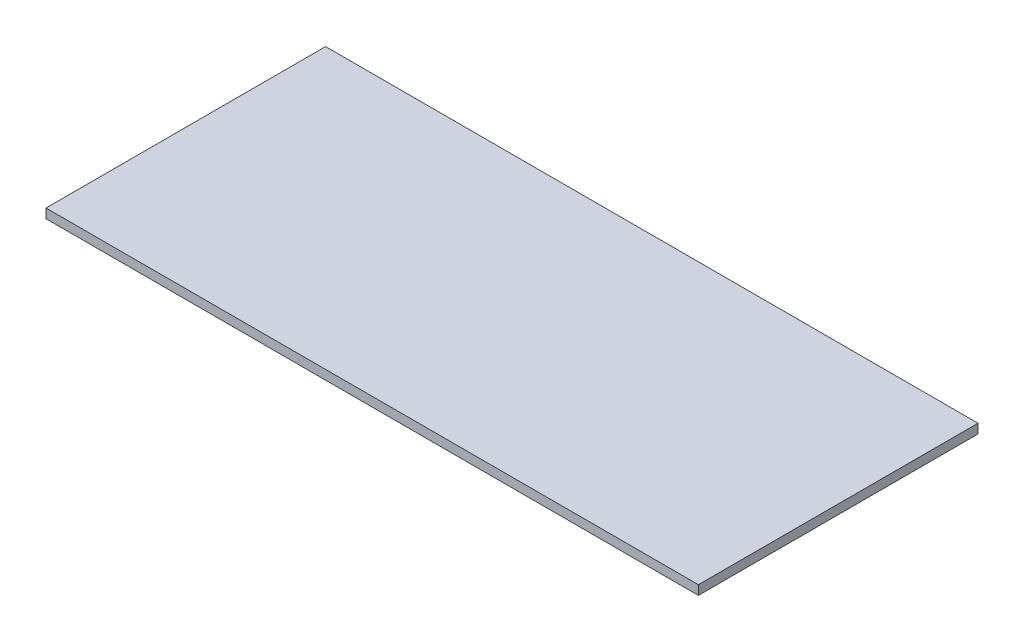
ISO-10303-21;
HEADER;
FILE_DESCRIPTION(('STEP AP214'),'2;1');
FILE_NAME('part.step','',(''),(''),'','','');
FILE_SCHEMA(('AUTOMOTIVE_DESIGN { 1 0 10303 214 1 1 1 1 }'));
ENDSEC;
DATA;
#1=APPLICATION_CONTEXT('core data for automotive mechanical design processes');
#2=APPLICATION_PROTOCOL_DEFINITION('international standard','automotive_design',2000,#1);
#3=PRODUCT_CONTEXT('',#1,'mechanical');
#4=PRODUCT('Part','Part','',(#3));
#5=PRODUCT_RELATED_PRODUCT_CATEGORY('part','',(#4));
#6=PRODUCT_DEFINITION_FORMATION('','',#4);
#7=PRODUCT_DEFINITION_CONTEXT('part definition',#1,'design');
#8=PRODUCT_DEFINITION('design','',#6,#7);
#9=PRODUCT_DEFINITION_SHAPE('','',#8);
#10=(LENGTH_UNIT() NAMED_UNIT(*) SI_UNIT(.MILLI.,.METRE.));
#11=(NAMED_UNIT(*) PLANE_ANGLE_UNIT() SI_UNIT($,.RADIAN.));
#12=(NAMED_UNIT(*) SI_UNIT($,.STERADIAN.) SOLID_ANGLE_UNIT());
#13=UNCERTAINTY_MEASURE_WITH_UNIT(LENGTH_MEASURE(1.E-05),#10,'distance_accuracy_value','');
#14=(GEOMETRIC_REPRESENTATION_CONTEXT(3) GLOBAL_UNCERTAINTY_ASSIGNED_CONTEXT((#13)) GLOBAL_UNIT_ASSIGNED_CONTEXT((#10,
#11,#12)) REPRESENTATION_CONTEXT('',''));
#15=CARTESIAN_POINT('',(0.,0.,0.));
#16=DIRECTION('',(0.,0.,1.));
#17=DIRECTION('',(1.,0.,0.));
#18=AXIS2_PLACEMENT_3D('',#15,#16,#17);
#19=CARTESIAN_POINT('',(350.,10.,150.));
#20=DIRECTION('',(-1.,0.,0.));
#21=DIRECTION('',(0.,0.,1.));
#22=AXIS2_PLACEMENT_3D('',#19,#20,#21);
#23=PLANE('',#22);
#24=DIRECTION('',(0.,0.,-1.));
#25=VECTOR('',#24,1.);
#26=CARTESIAN_POINT('',(350.,0.,150.));
#27=LINE('',#26,#25);
#28=CARTESIAN_POINT('',(350.,0.,150.));
#29=VERTEX_POINT('',#28);
#30=CARTESIAN_POINT('',(350.,0.,-150.));
#31=VERTEX_POINT('',#30);
#32=EDGE_CURVE('E95',#29,#31,#27,.T.);
#33=ORIENTED_EDGE('',*,*,#32,.T.);
#34=DIRECTION('',(0.,-1.,0.));
#35=VECTOR('',#34,1.);
#36=CARTESIAN_POINT('',(350.,10.,-150.));
#37=LINE('',#36,#35);
#38=CARTESIAN_POINT('',(350.,10.,-150.));
#39=VERTEX_POINT('',#38);
#40=EDGE_CURVE('E11',#39,#31,#37,.T.);
#41=ORIENTED_EDGE('',*,*,#40,.F.);
#42=DIRECTION('',(0.,0.,-1.));
#43=VECTOR('',#42,1.);
#44=CARTESIAN_POINT('',(350.,10.,150.));
#45=LINE('',#44,#43);
#46=CARTESIAN_POINT('',(350.,10.,150.));
#47=VERTEX_POINT('',#46);
#48=EDGE_CURVE('E83',#47,#39,#45,.T.);
#49=ORIENTED_EDGE('',*,*,#48,.F.);
#50=DIRECTION('',(0.,-1.,0.));
#51=VECTOR('',#50,1.);
#52=CARTESIAN_POINT('',(350.,10.,150.));
#53=LINE('',#52,#51);
#54=EDGE_CURVE('E91',#47,#29,#53,.T.);
#55=ORIENTED_EDGE('',*,*,#54,.T.);
#56=EDGE_LOOP('',(#33,#41,#49,#55));
#57=FACE_BOUND('',#56,.T.);
#58=ADVANCED_FACE('F32',(#57),#23,.F.);
#59=CARTESIAN_POINT('',(-350.,10.,-150.));
#60=DIRECTION('',(0.,0.,1.));
#61=DIRECTION('',(1.,0.,0.));
#62=AXIS2_PLACEMENT_3D('',#59,#60,#61);
#63=PLANE('',#62);
#64=DIRECTION('',(-1.,0.,0.));
#65=VECTOR('',#64,1.);
#66=CARTESIAN_POINT('',(-350.,0.,-150.));
#67=LINE('',#66,#65);
#68=CARTESIAN_POINT('',(-350.,0.,-150.));
#69=VERTEX_POINT('',#68);
#70=EDGE_CURVE('E87',#31,#69,#67,.T.);
#71=ORIENTED_EDGE('',*,*,#70,.T.);
#72=DIRECTION('',(0.,-1.,0.));
#73=VECTOR('',#72,1.);
#74=CARTESIAN_POINT('',(-350.,10.,-150.));
#75=LINE('',#74,#73);
#76=CARTESIAN_POINT('',(-350.,10.,-150.));
#77=VERTEX_POINT('',#76);
#78=EDGE_CURVE('E40',#77,#69,#75,.T.);
#79=ORIENTED_EDGE('',*,*,#78,.F.);
#80=DIRECTION('',(-1.,0.,0.));
#81=VECTOR('',#80,1.);
#82=CARTESIAN_POINT('',(-350.,10.,-150.));
#83=LINE('',#82,#81);
#84=EDGE_CURVE('E78',#39,#77,#83,.T.);
#85=ORIENTED_EDGE('',*,*,#84,.F.);
#86=ORIENTED_EDGE('',*,*,#40,.T.);
#87=EDGE_LOOP('',(#71,#79,#85,#86));
#88=FACE_BOUND('',#87,.T.);
#89=ADVANCED_FACE('F86',(#88),#63,.F.);
#90=CARTESIAN_POINT('',(-350.,10.,150.));
#91=DIRECTION('',(1.,0.,0.));
#92=DIRECTION('',(0.,0.,-1.));
#93=AXIS2_PLACEMENT_3D('',#90,#91,#92);
#94=PLANE('',#93);
#95=DIRECTION('',(0.,0.,1.));
#96=VECTOR('',#95,1.);
#97=CARTESIAN_POINT('',(-350.,0.,150.));
#98=LINE('',#97,#96);
#99=CARTESIAN_POINT('',(-350.,0.,150.));
#100=VERTEX_POINT('',#99);
#101=EDGE_CURVE('E65',#69,#100,#98,.T.);
#102=ORIENTED_EDGE('',*,*,#101,.T.);
#103=DIRECTION('',(0.,-1.,0.));
#104=VECTOR('',#103,1.);
#105=CARTESIAN_POINT('',(-350.,10.,150.));
#106=LINE('',#105,#104);
#107=CARTESIAN_POINT('',(-350.,10.,150.));
#108=VERTEX_POINT('',#107);
#109=EDGE_CURVE('E88',#108,#100,#106,.T.);
#110=ORIENTED_EDGE('',*,*,#109,.F.);
#111=DIRECTION('',(0.,0.,1.));
#112=VECTOR('',#111,1.);
#113=CARTESIAN_POINT('',(-350.,10.,150.));
#114=LINE('',#113,#112);
#115=EDGE_CURVE('E81',#77,#108,#114,.T.);
#116=ORIENTED_EDGE('',*,*,#115,.F.);
#117=ORIENTED_EDGE('',*,*,#78,.T.);
#118=EDGE_LOOP('',(#102,#110,#116,#117));
#119=FACE_BOUND('',#118,.T.);
#120=ADVANCED_FACE('F89',(#119),#94,.F.);
#121=CARTESIAN_POINT('',(-350.,10.,150.));
#122=DIRECTION('',(0.,0.,-1.));
#123=DIRECTION('',(-1.,0.,0.));
#124=AXIS2_PLACEMENT_3D('',#121,#122,#123);
#125=PLANE('',#124);
#126=DIRECTION('',(1.,0.,0.));
#127=VECTOR('',#126,1.);
#128=CARTESIAN_POINT('',(-350.,0.,150.));
#129=LINE('',#128,#127);
#130=EDGE_CURVE('E71',#100,#29,#129,.T.);
#131=ORIENTED_EDGE('',*,*,#130,.T.);
#132=ORIENTED_EDGE('',*,*,#54,.F.);
#133=DIRECTION('',(1.,0.,0.));
#134=VECTOR('',#133,1.);
#135=CARTESIAN_POINT('',(-350.,10.,150.));
#136=LINE('',#135,#134);
#137=EDGE_CURVE('E48',#108,#47,#136,.T.);
#138=ORIENTED_EDGE('',*,*,#137,.F.);
#139=ORIENTED_EDGE('',*,*,#109,.T.);
#140=EDGE_LOOP('',(#131,#132,#138,#139));
#141=FACE_BOUND('',#140,.T.);
#142=ADVANCED_FACE('F102',(#141),#125,.F.);
#143=CARTESIAN_POINT('',(0.,10.,0.));
#144=DIRECTION('',(0.,-1.,0.));
#145=DIRECTION('',(0.,0.,-1.));
#146=AXIS2_PLACEMENT_3D('',#143,#144,#145);
#147=PLANE('',#146);
#148=ORIENTED_EDGE('',*,*,#48,.T.);
#149=ORIENTED_EDGE('',*,*,#84,.T.);
#150=ORIENTED_EDGE('',*,*,#115,.T.);
#151=ORIENTED_EDGE('',*,*,#137,.T.);
#152=EDGE_LOOP('',(#148,#149,#150,#151));
#153=FACE_BOUND('',#152,.T.);
#154=ADVANCED_FACE('F79',(#153),#147,.F.);
#155=CARTESIAN_POINT('',(0.,0.,0.));
#156=DIRECTION('',(0.,-1.,0.));
#157=DIRECTION('',(0.,0.,-1.));
#158=AXIS2_PLACEMENT_3D('',#155,#156,#157);
#159=PLANE('',#158);
#160=ORIENTED_EDGE('',*,*,#32,.F.);
#161=ORIENTED_EDGE('',*,*,#130,.F.);
#162=ORIENTED_EDGE('',*,*,#101,.F.);
#163=ORIENTED_EDGE('',*,*,#70,.F.);
#164=EDGE_LOOP('',(#160,#161,#162,#163));
#165=FACE_BOUND('',#164,.T.);
#166=ADVANCED_FACE('F105',(#165),#159,.T.);
#167=CLOSED_SHELL('',(#58,#89,#120,#142,#154,#166));
#168=MANIFOLD_SOLID_BREP('B2',#167);
#169=ADVANCED_BREP_SHAPE_REPRESENTATION('',(#18,#168),#14);
#170=SHAPE_DEFINITION_REPRESENTATION(#9,#169);
ENDSEC;
END-ISO-10303-21;
